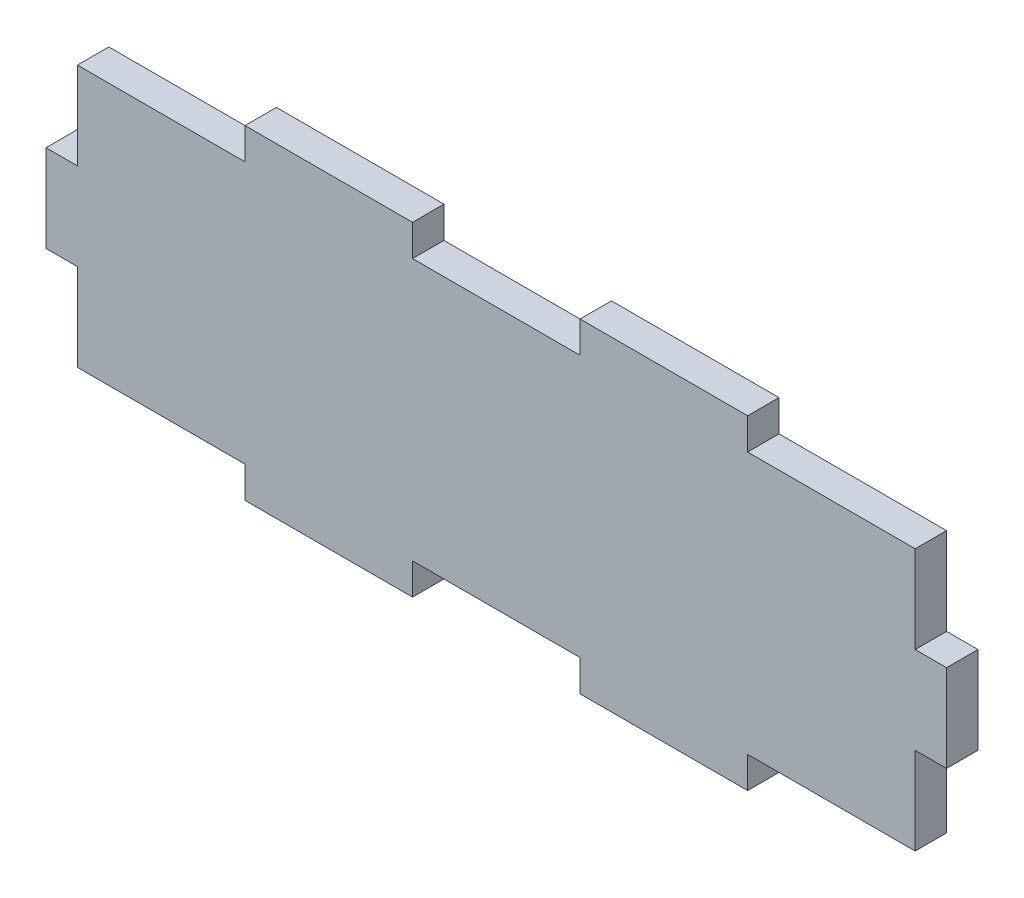
ISO-10303-21;
HEADER;
FILE_DESCRIPTION(('STEP AP214'),'2;1');
FILE_NAME('part.step','',(''),(''),'','','');
FILE_SCHEMA(('AUTOMOTIVE_DESIGN { 1 0 10303 214 1 1 1 1 }'));
ENDSEC;
DATA;
#1=APPLICATION_CONTEXT('core data for automotive mechanical design processes');
#2=APPLICATION_PROTOCOL_DEFINITION('international standard','automotive_design',2000,#1);
#3=PRODUCT_CONTEXT('',#1,'mechanical');
#4=PRODUCT('Part','Part','',(#3));
#5=PRODUCT_RELATED_PRODUCT_CATEGORY('part','',(#4));
#6=PRODUCT_DEFINITION_FORMATION('','',#4);
#7=PRODUCT_DEFINITION_CONTEXT('part definition',#1,'design');
#8=PRODUCT_DEFINITION('design','',#6,#7);
#9=PRODUCT_DEFINITION_SHAPE('','',#8);
#10=(LENGTH_UNIT() NAMED_UNIT(*) SI_UNIT(.MILLI.,.METRE.));
#11=(NAMED_UNIT(*) PLANE_ANGLE_UNIT() SI_UNIT($,.RADIAN.));
#12=(NAMED_UNIT(*) SI_UNIT($,.STERADIAN.) SOLID_ANGLE_UNIT());
#13=UNCERTAINTY_MEASURE_WITH_UNIT(LENGTH_MEASURE(1.E-05),#10,'distance_accuracy_value','');
#14=(GEOMETRIC_REPRESENTATION_CONTEXT(3) GLOBAL_UNCERTAINTY_ASSIGNED_CONTEXT((#13)) GLOBAL_UNIT_ASSIGNED_CONTEXT((#10,
#11,#12)) REPRESENTATION_CONTEXT('',''));
#15=CARTESIAN_POINT('',(0.,0.,0.));
#16=DIRECTION('',(0.,0.,1.));
#17=DIRECTION('',(1.,0.,0.));
#18=AXIS2_PLACEMENT_3D('',#15,#16,#17);
#19=CARTESIAN_POINT('',(0.,0.,3.));
#20=DIRECTION('',(1.,0.,0.));
#21=DIRECTION('',(0.,1.,0.));
#22=AXIS2_PLACEMENT_3D('',#19,#20,#21);
#23=PLANE('',#22);
#24=DIRECTION('',(0.,-1.,0.));
#25=VECTOR('',#24,1.);
#26=CARTESIAN_POINT('',(0.,0.,0.));
#27=LINE('',#26,#25);
#28=CARTESIAN_POINT('',(0.,8.33333333333333,0.));
#29=VERTEX_POINT('',#28);
#30=CARTESIAN_POINT('',(0.,0.,0.));
#31=VERTEX_POINT('',#30);
#32=EDGE_CURVE('E249',#29,#31,#27,.T.);
#33=ORIENTED_EDGE('',*,*,#32,.T.);
#34=DIRECTION('',(0.,0.,-1.));
#35=VECTOR('',#34,1.);
#36=CARTESIAN_POINT('',(0.,0.,3.));
#37=LINE('',#36,#35);
#38=CARTESIAN_POINT('',(0.,0.,3.));
#39=VERTEX_POINT('',#38);
#40=EDGE_CURVE('E11',#39,#31,#37,.T.);
#41=ORIENTED_EDGE('',*,*,#40,.F.);
#42=DIRECTION('',(0.,-1.,0.));
#43=VECTOR('',#42,1.);
#44=CARTESIAN_POINT('',(0.,0.,3.));
#45=LINE('',#44,#43);
#46=CARTESIAN_POINT('',(0.,8.33333333333333,3.));
#47=VERTEX_POINT('',#46);
#48=EDGE_CURVE('E303',#47,#39,#45,.T.);
#49=ORIENTED_EDGE('',*,*,#48,.F.);
#50=DIRECTION('',(0.,0.,-1.));
#51=VECTOR('',#50,1.);
#52=CARTESIAN_POINT('',(0.,8.33333333333333,3.));
#53=LINE('',#52,#51);
#54=EDGE_CURVE('E245',#47,#29,#53,.T.);
#55=ORIENTED_EDGE('',*,*,#54,.T.);
#56=EDGE_LOOP('',(#33,#41,#49,#55));
#57=FACE_BOUND('',#56,.T.);
#58=ADVANCED_FACE('F33',(#57),#23,.F.);
#59=CARTESIAN_POINT('',(0.,0.,3.));
#60=DIRECTION('',(0.,1.,0.));
#61=DIRECTION('',(0.,0.,1.));
#62=AXIS2_PLACEMENT_3D('',#59,#60,#61);
#63=PLANE('',#62);
#64=DIRECTION('',(1.,0.,0.));
#65=VECTOR('',#64,1.);
#66=CARTESIAN_POINT('',(0.,0.,0.));
#67=LINE('',#66,#65);
#68=CARTESIAN_POINT('',(16.,0.,0.));
#69=VERTEX_POINT('',#68);
#70=EDGE_CURVE('E252',#31,#69,#67,.T.);
#71=ORIENTED_EDGE('',*,*,#70,.T.);
#72=DIRECTION('',(0.,0.,-1.));
#73=VECTOR('',#72,1.);
#74=CARTESIAN_POINT('',(16.,0.,3.));
#75=LINE('',#74,#73);
#76=CARTESIAN_POINT('',(16.,0.,3.));
#77=VERTEX_POINT('',#76);
#78=EDGE_CURVE('E41',#77,#69,#75,.T.);
#79=ORIENTED_EDGE('',*,*,#78,.F.);
#80=DIRECTION('',(1.,0.,0.));
#81=VECTOR('',#80,1.);
#82=CARTESIAN_POINT('',(0.,0.,3.));
#83=LINE('',#82,#81);
#84=EDGE_CURVE('E152',#39,#77,#83,.T.);
#85=ORIENTED_EDGE('',*,*,#84,.F.);
#86=ORIENTED_EDGE('',*,*,#40,.T.);
#87=EDGE_LOOP('',(#71,#79,#85,#86));
#88=FACE_BOUND('',#87,.T.);
#89=ADVANCED_FACE('F461',(#88),#63,.F.);
#90=CARTESIAN_POINT('',(16.,0.,3.));
#91=DIRECTION('',(1.,0.,0.));
#92=DIRECTION('',(0.,0.,-1.));
#93=AXIS2_PLACEMENT_3D('',#90,#91,#92);
#94=PLANE('',#93);
#95=DIRECTION('',(0.,-1.,0.));
#96=VECTOR('',#95,1.);
#97=CARTESIAN_POINT('',(16.,0.,0.));
#98=LINE('',#97,#96);
#99=CARTESIAN_POINT('',(16.,-3.,0.));
#100=VERTEX_POINT('',#99);
#101=EDGE_CURVE('E254',#69,#100,#98,.T.);
#102=ORIENTED_EDGE('',*,*,#101,.T.);
#103=DIRECTION('',(0.,0.,-1.));
#104=VECTOR('',#103,1.);
#105=CARTESIAN_POINT('',(16.,-3.,3.));
#106=LINE('',#105,#104);
#107=CARTESIAN_POINT('',(16.,-3.,3.));
#108=VERTEX_POINT('',#107);
#109=EDGE_CURVE('E370',#108,#100,#106,.T.);
#110=ORIENTED_EDGE('',*,*,#109,.F.);
#111=DIRECTION('',(0.,-1.,0.));
#112=VECTOR('',#111,1.);
#113=CARTESIAN_POINT('',(16.,0.,3.));
#114=LINE('',#113,#112);
#115=EDGE_CURVE('E378',#77,#108,#114,.T.);
#116=ORIENTED_EDGE('',*,*,#115,.F.);
#117=ORIENTED_EDGE('',*,*,#78,.T.);
#118=EDGE_LOOP('',(#102,#110,#116,#117));
#119=FACE_BOUND('',#118,.T.);
#120=ADVANCED_FACE('F376',(#119),#94,.F.);
#121=CARTESIAN_POINT('',(16.,-3.,3.));
#122=DIRECTION('',(0.,1.,0.));
#123=DIRECTION('',(0.,0.,1.));
#124=AXIS2_PLACEMENT_3D('',#121,#122,#123);
#125=PLANE('',#124);
#126=DIRECTION('',(1.,0.,0.));
#127=VECTOR('',#126,1.);
#128=CARTESIAN_POINT('',(16.,-3.,0.));
#129=LINE('',#128,#127);
#130=CARTESIAN_POINT('',(32.,-3.,0.));
#131=VERTEX_POINT('',#130);
#132=EDGE_CURVE('E256',#100,#131,#129,.T.);
#133=ORIENTED_EDGE('',*,*,#132,.T.);
#134=DIRECTION('',(0.,0.,-1.));
#135=VECTOR('',#134,1.);
#136=CARTESIAN_POINT('',(32.,-3.,3.));
#137=LINE('',#136,#135);
#138=CARTESIAN_POINT('',(32.,-3.,3.));
#139=VERTEX_POINT('',#138);
#140=EDGE_CURVE('E367',#139,#131,#137,.T.);
#141=ORIENTED_EDGE('',*,*,#140,.F.);
#142=DIRECTION('',(1.,0.,0.));
#143=VECTOR('',#142,1.);
#144=CARTESIAN_POINT('',(16.,-3.,3.));
#145=LINE('',#144,#143);
#146=EDGE_CURVE('E396',#108,#139,#145,.T.);
#147=ORIENTED_EDGE('',*,*,#146,.F.);
#148=ORIENTED_EDGE('',*,*,#109,.T.);
#149=EDGE_LOOP('',(#133,#141,#147,#148));
#150=FACE_BOUND('',#149,.T.);
#151=ADVANCED_FACE('F387',(#150),#125,.F.);
#152=CARTESIAN_POINT('',(32.,0.,3.));
#153=DIRECTION('',(-1.,0.,0.));
#154=DIRECTION('',(0.,0.,1.));
#155=AXIS2_PLACEMENT_3D('',#152,#153,#154);
#156=PLANE('',#155);
#157=DIRECTION('',(0.,1.,0.));
#158=VECTOR('',#157,1.);
#159=CARTESIAN_POINT('',(32.,0.,0.));
#160=LINE('',#159,#158);
#161=CARTESIAN_POINT('',(32.,0.,0.));
#162=VERTEX_POINT('',#161);
#163=EDGE_CURVE('E258',#131,#162,#160,.T.);
#164=ORIENTED_EDGE('',*,*,#163,.T.);
#165=DIRECTION('',(0.,0.,-1.));
#166=VECTOR('',#165,1.);
#167=CARTESIAN_POINT('',(32.,0.,3.));
#168=LINE('',#167,#166);
#169=CARTESIAN_POINT('',(32.,0.,3.));
#170=VERTEX_POINT('',#169);
#171=EDGE_CURVE('E364',#170,#162,#168,.T.);
#172=ORIENTED_EDGE('',*,*,#171,.F.);
#173=DIRECTION('',(0.,1.,0.));
#174=VECTOR('',#173,1.);
#175=CARTESIAN_POINT('',(32.,0.,3.));
#176=LINE('',#175,#174);
#177=EDGE_CURVE('E393',#139,#170,#176,.T.);
#178=ORIENTED_EDGE('',*,*,#177,.F.);
#179=ORIENTED_EDGE('',*,*,#140,.T.);
#180=EDGE_LOOP('',(#164,#172,#178,#179));
#181=FACE_BOUND('',#180,.T.);
#182=ADVANCED_FACE('F391',(#181),#156,.F.);
#183=CARTESIAN_POINT('',(32.,0.,3.));
#184=DIRECTION('',(0.,1.,0.));
#185=DIRECTION('',(0.,0.,1.));
#186=AXIS2_PLACEMENT_3D('',#183,#184,#185);
#187=PLANE('',#186);
#188=DIRECTION('',(1.,0.,0.));
#189=VECTOR('',#188,1.);
#190=CARTESIAN_POINT('',(32.,0.,0.));
#191=LINE('',#190,#189);
#192=CARTESIAN_POINT('',(48.,0.,0.));
#193=VERTEX_POINT('',#192);
#194=EDGE_CURVE('E260',#162,#193,#191,.T.);
#195=ORIENTED_EDGE('',*,*,#194,.T.);
#196=DIRECTION('',(0.,0.,-1.));
#197=VECTOR('',#196,1.);
#198=CARTESIAN_POINT('',(48.,0.,3.));
#199=LINE('',#198,#197);
#200=CARTESIAN_POINT('',(48.,0.,3.));
#201=VERTEX_POINT('',#200);
#202=EDGE_CURVE('E361',#201,#193,#199,.T.);
#203=ORIENTED_EDGE('',*,*,#202,.F.);
#204=DIRECTION('',(1.,0.,0.));
#205=VECTOR('',#204,1.);
#206=CARTESIAN_POINT('',(32.,0.,3.));
#207=LINE('',#206,#205);
#208=EDGE_CURVE('E395',#170,#201,#207,.T.);
#209=ORIENTED_EDGE('',*,*,#208,.F.);
#210=ORIENTED_EDGE('',*,*,#171,.T.);
#211=EDGE_LOOP('',(#195,#203,#209,#210));
#212=FACE_BOUND('',#211,.T.);
#213=ADVANCED_FACE('F474',(#212),#187,.F.);
#214=CARTESIAN_POINT('',(48.,0.,3.));
#215=DIRECTION('',(1.,0.,0.));
#216=DIRECTION('',(0.,0.,-1.));
#217=AXIS2_PLACEMENT_3D('',#214,#215,#216);
#218=PLANE('',#217);
#219=DIRECTION('',(0.,-1.,0.));
#220=VECTOR('',#219,1.);
#221=CARTESIAN_POINT('',(48.,0.,0.));
#222=LINE('',#221,#220);
#223=CARTESIAN_POINT('',(48.,-3.,0.));
#224=VERTEX_POINT('',#223);
#225=EDGE_CURVE('E262',#193,#224,#222,.T.);
#226=ORIENTED_EDGE('',*,*,#225,.T.);
#227=DIRECTION('',(0.,0.,-1.));
#228=VECTOR('',#227,1.);
#229=CARTESIAN_POINT('',(48.,-3.,3.));
#230=LINE('',#229,#228);
#231=CARTESIAN_POINT('',(48.,-3.,3.));
#232=VERTEX_POINT('',#231);
#233=EDGE_CURVE('E358',#232,#224,#230,.T.);
#234=ORIENTED_EDGE('',*,*,#233,.F.);
#235=DIRECTION('',(0.,-1.,0.));
#236=VECTOR('',#235,1.);
#237=CARTESIAN_POINT('',(48.,0.,3.));
#238=LINE('',#237,#236);
#239=EDGE_CURVE('E398',#201,#232,#238,.T.);
#240=ORIENTED_EDGE('',*,*,#239,.F.);
#241=ORIENTED_EDGE('',*,*,#202,.T.);
#242=EDGE_LOOP('',(#226,#234,#240,#241));
#243=FACE_BOUND('',#242,.T.);
#244=ADVANCED_FACE('F477',(#243),#218,.F.);
#245=CARTESIAN_POINT('',(48.,-3.,3.));
#246=DIRECTION('',(0.,1.,0.));
#247=DIRECTION('',(0.,0.,1.));
#248=AXIS2_PLACEMENT_3D('',#245,#246,#247);
#249=PLANE('',#248);
#250=DIRECTION('',(1.,0.,0.));
#251=VECTOR('',#250,1.);
#252=CARTESIAN_POINT('',(48.,-3.,0.));
#253=LINE('',#252,#251);
#254=CARTESIAN_POINT('',(64.,-3.,0.));
#255=VERTEX_POINT('',#254);
#256=EDGE_CURVE('E264',#224,#255,#253,.T.);
#257=ORIENTED_EDGE('',*,*,#256,.T.);
#258=DIRECTION('',(0.,0.,-1.));
#259=VECTOR('',#258,1.);
#260=CARTESIAN_POINT('',(64.,-3.,3.));
#261=LINE('',#260,#259);
#262=CARTESIAN_POINT('',(64.,-3.,3.));
#263=VERTEX_POINT('',#262);
#264=EDGE_CURVE('E355',#263,#255,#261,.T.);
#265=ORIENTED_EDGE('',*,*,#264,.F.);
#266=DIRECTION('',(1.,0.,0.));
#267=VECTOR('',#266,1.);
#268=CARTESIAN_POINT('',(48.,-3.,3.));
#269=LINE('',#268,#267);
#270=EDGE_CURVE('E404',#232,#263,#269,.T.);
#271=ORIENTED_EDGE('',*,*,#270,.F.);
#272=ORIENTED_EDGE('',*,*,#233,.T.);
#273=EDGE_LOOP('',(#257,#265,#271,#272));
#274=FACE_BOUND('',#273,.T.);
#275=ADVANCED_FACE('F481',(#274),#249,.F.);
#276=CARTESIAN_POINT('',(64.,0.,3.));
#277=DIRECTION('',(-1.,0.,0.));
#278=DIRECTION('',(0.,0.,1.));
#279=AXIS2_PLACEMENT_3D('',#276,#277,#278);
#280=PLANE('',#279);
#281=DIRECTION('',(0.,1.,0.));
#282=VECTOR('',#281,1.);
#283=CARTESIAN_POINT('',(64.,0.,0.));
#284=LINE('',#283,#282);
#285=CARTESIAN_POINT('',(64.,0.,0.));
#286=VERTEX_POINT('',#285);
#287=EDGE_CURVE('E266',#255,#286,#284,.T.);
#288=ORIENTED_EDGE('',*,*,#287,.T.);
#289=DIRECTION('',(0.,0.,-1.));
#290=VECTOR('',#289,1.);
#291=CARTESIAN_POINT('',(64.,0.,3.));
#292=LINE('',#291,#290);
#293=CARTESIAN_POINT('',(64.,0.,3.));
#294=VERTEX_POINT('',#293);
#295=EDGE_CURVE('E352',#294,#286,#292,.T.);
#296=ORIENTED_EDGE('',*,*,#295,.F.);
#297=DIRECTION('',(0.,1.,0.));
#298=VECTOR('',#297,1.);
#299=CARTESIAN_POINT('',(64.,0.,3.));
#300=LINE('',#299,#298);
#301=EDGE_CURVE('E406',#263,#294,#300,.T.);
#302=ORIENTED_EDGE('',*,*,#301,.F.);
#303=ORIENTED_EDGE('',*,*,#264,.T.);
#304=EDGE_LOOP('',(#288,#296,#302,#303));
#305=FACE_BOUND('',#304,.T.);
#306=ADVANCED_FACE('F485',(#305),#280,.F.);
#307=CARTESIAN_POINT('',(64.,0.,3.));
#308=DIRECTION('',(0.,1.,0.));
#309=DIRECTION('',(0.,0.,1.));
#310=AXIS2_PLACEMENT_3D('',#307,#308,#309);
#311=PLANE('',#310);
#312=DIRECTION('',(1.,0.,0.));
#313=VECTOR('',#312,1.);
#314=CARTESIAN_POINT('',(64.,0.,0.));
#315=LINE('',#314,#313);
#316=CARTESIAN_POINT('',(80.,0.,0.));
#317=VERTEX_POINT('',#316);
#318=EDGE_CURVE('E268',#286,#317,#315,.T.);
#319=ORIENTED_EDGE('',*,*,#318,.T.);
#320=DIRECTION('',(0.,0.,-1.));
#321=VECTOR('',#320,1.);
#322=CARTESIAN_POINT('',(80.,0.,3.));
#323=LINE('',#322,#321);
#324=CARTESIAN_POINT('',(80.,0.,3.));
#325=VERTEX_POINT('',#324);
#326=EDGE_CURVE('E349',#325,#317,#323,.T.);
#327=ORIENTED_EDGE('',*,*,#326,.F.);
#328=DIRECTION('',(1.,0.,0.));
#329=VECTOR('',#328,1.);
#330=CARTESIAN_POINT('',(64.,0.,3.));
#331=LINE('',#330,#329);
#332=EDGE_CURVE('E408',#294,#325,#331,.T.);
#333=ORIENTED_EDGE('',*,*,#332,.F.);
#334=ORIENTED_EDGE('',*,*,#295,.T.);
#335=EDGE_LOOP('',(#319,#327,#333,#334));
#336=FACE_BOUND('',#335,.T.);
#337=ADVANCED_FACE('F489',(#336),#311,.F.);
#338=CARTESIAN_POINT('',(80.,0.,3.));
#339=DIRECTION('',(-1.,0.,0.));
#340=DIRECTION('',(0.,0.,1.));
#341=AXIS2_PLACEMENT_3D('',#338,#339,#340);
#342=PLANE('',#341);
#343=DIRECTION('',(0.,1.,0.));
#344=VECTOR('',#343,1.);
#345=CARTESIAN_POINT('',(80.,0.,0.));
#346=LINE('',#345,#344);
#347=CARTESIAN_POINT('',(80.,8.33333333333333,0.));
#348=VERTEX_POINT('',#347);
#349=EDGE_CURVE('E270',#317,#348,#346,.T.);
#350=ORIENTED_EDGE('',*,*,#349,.T.);
#351=DIRECTION('',(0.,0.,-1.));
#352=VECTOR('',#351,1.);
#353=CARTESIAN_POINT('',(80.,8.33333333333333,3.));
#354=LINE('',#353,#352);
#355=CARTESIAN_POINT('',(80.,8.33333333333333,3.));
#356=VERTEX_POINT('',#355);
#357=EDGE_CURVE('E346',#356,#348,#354,.T.);
#358=ORIENTED_EDGE('',*,*,#357,.F.);
#359=DIRECTION('',(0.,1.,0.));
#360=VECTOR('',#359,1.);
#361=CARTESIAN_POINT('',(80.,0.,3.));
#362=LINE('',#361,#360);
#363=EDGE_CURVE('E410',#325,#356,#362,.T.);
#364=ORIENTED_EDGE('',*,*,#363,.F.);
#365=ORIENTED_EDGE('',*,*,#326,.T.);
#366=EDGE_LOOP('',(#350,#358,#364,#365));
#367=FACE_BOUND('',#366,.T.);
#368=ADVANCED_FACE('F493',(#367),#342,.F.);
#369=CARTESIAN_POINT('',(80.,8.33333333333333,3.));
#370=DIRECTION('',(0.,1.,0.));
#371=DIRECTION('',(0.,0.,1.));
#372=AXIS2_PLACEMENT_3D('',#369,#370,#371);
#373=PLANE('',#372);
#374=DIRECTION('',(1.,0.,0.));
#375=VECTOR('',#374,1.);
#376=CARTESIAN_POINT('',(80.,8.33333333333333,0.));
#377=LINE('',#376,#375);
#378=CARTESIAN_POINT('',(83.,8.33333333333333,0.));
#379=VERTEX_POINT('',#378);
#380=EDGE_CURVE('E272',#348,#379,#377,.T.);
#381=ORIENTED_EDGE('',*,*,#380,.T.);
#382=DIRECTION('',(0.,0.,-1.));
#383=VECTOR('',#382,1.);
#384=CARTESIAN_POINT('',(83.,8.33333333333333,3.));
#385=LINE('',#384,#383);
#386=CARTESIAN_POINT('',(83.,8.33333333333333,3.));
#387=VERTEX_POINT('',#386);
#388=EDGE_CURVE('E343',#387,#379,#385,.T.);
#389=ORIENTED_EDGE('',*,*,#388,.F.);
#390=DIRECTION('',(1.,0.,0.));
#391=VECTOR('',#390,1.);
#392=CARTESIAN_POINT('',(80.,8.33333333333333,3.));
#393=LINE('',#392,#391);
#394=EDGE_CURVE('E412',#356,#387,#393,.T.);
#395=ORIENTED_EDGE('',*,*,#394,.F.);
#396=ORIENTED_EDGE('',*,*,#357,.T.);
#397=EDGE_LOOP('',(#381,#389,#395,#396));
#398=FACE_BOUND('',#397,.T.);
#399=ADVANCED_FACE('F497',(#398),#373,.F.);
#400=CARTESIAN_POINT('',(83.,16.6666666666667,3.));
#401=DIRECTION('',(-1.,0.,0.));
#402=DIRECTION('',(0.,0.,1.));
#403=AXIS2_PLACEMENT_3D('',#400,#401,#402);
#404=PLANE('',#403);
#405=DIRECTION('',(0.,1.,0.));
#406=VECTOR('',#405,1.);
#407=CARTESIAN_POINT('',(83.,16.6666666666667,0.));
#408=LINE('',#407,#406);
#409=CARTESIAN_POINT('',(83.,16.6666666666667,0.));
#410=VERTEX_POINT('',#409);
#411=EDGE_CURVE('E274',#379,#410,#408,.T.);
#412=ORIENTED_EDGE('',*,*,#411,.T.);
#413=DIRECTION('',(0.,0.,-1.));
#414=VECTOR('',#413,1.);
#415=CARTESIAN_POINT('',(83.,16.6666666666667,3.));
#416=LINE('',#415,#414);
#417=CARTESIAN_POINT('',(83.,16.6666666666667,3.));
#418=VERTEX_POINT('',#417);
#419=EDGE_CURVE('E340',#418,#410,#416,.T.);
#420=ORIENTED_EDGE('',*,*,#419,.F.);
#421=DIRECTION('',(0.,1.,0.));
#422=VECTOR('',#421,1.);
#423=CARTESIAN_POINT('',(83.,16.6666666666667,3.));
#424=LINE('',#423,#422);
#425=EDGE_CURVE('E414',#387,#418,#424,.T.);
#426=ORIENTED_EDGE('',*,*,#425,.F.);
#427=ORIENTED_EDGE('',*,*,#388,.T.);
#428=EDGE_LOOP('',(#412,#420,#426,#427));
#429=FACE_BOUND('',#428,.T.);
#430=ADVANCED_FACE('F501',(#429),#404,.F.);
#431=CARTESIAN_POINT('',(80.,16.6666666666667,3.));
#432=DIRECTION('',(0.,-1.,0.));
#433=DIRECTION('',(0.,0.,-1.));
#434=AXIS2_PLACEMENT_3D('',#431,#432,#433);
#435=PLANE('',#434);
#436=DIRECTION('',(-1.,0.,0.));
#437=VECTOR('',#436,1.);
#438=CARTESIAN_POINT('',(80.,16.6666666666667,0.));
#439=LINE('',#438,#437);
#440=CARTESIAN_POINT('',(80.,16.6666666666667,0.));
#441=VERTEX_POINT('',#440);
#442=EDGE_CURVE('E276',#410,#441,#439,.T.);
#443=ORIENTED_EDGE('',*,*,#442,.T.);
#444=DIRECTION('',(0.,0.,-1.));
#445=VECTOR('',#444,1.);
#446=CARTESIAN_POINT('',(80.,16.6666666666667,3.));
#447=LINE('',#446,#445);
#448=CARTESIAN_POINT('',(80.,16.6666666666667,3.));
#449=VERTEX_POINT('',#448);
#450=EDGE_CURVE('E337',#449,#441,#447,.T.);
#451=ORIENTED_EDGE('',*,*,#450,.F.);
#452=DIRECTION('',(-1.,0.,0.));
#453=VECTOR('',#452,1.);
#454=CARTESIAN_POINT('',(80.,16.6666666666667,3.));
#455=LINE('',#454,#453);
#456=EDGE_CURVE('E416',#418,#449,#455,.T.);
#457=ORIENTED_EDGE('',*,*,#456,.F.);
#458=ORIENTED_EDGE('',*,*,#419,.T.);
#459=EDGE_LOOP('',(#443,#451,#457,#458));
#460=FACE_BOUND('',#459,.T.);
#461=ADVANCED_FACE('F505',(#460),#435,.F.);
#462=CARTESIAN_POINT('',(80.,16.6666666666667,3.));
#463=DIRECTION('',(-1.,0.,0.));
#464=DIRECTION('',(0.,0.,1.));
#465=AXIS2_PLACEMENT_3D('',#462,#463,#464);
#466=PLANE('',#465);
#467=DIRECTION('',(0.,1.,0.));
#468=VECTOR('',#467,1.);
#469=CARTESIAN_POINT('',(80.,16.6666666666667,0.));
#470=LINE('',#469,#468);
#471=CARTESIAN_POINT('',(80.,25.,0.));
#472=VERTEX_POINT('',#471);
#473=EDGE_CURVE('E278',#441,#472,#470,.T.);
#474=ORIENTED_EDGE('',*,*,#473,.T.);
#475=DIRECTION('',(0.,0.,-1.));
#476=VECTOR('',#475,1.);
#477=CARTESIAN_POINT('',(80.,25.,3.));
#478=LINE('',#477,#476);
#479=CARTESIAN_POINT('',(80.,25.,3.));
#480=VERTEX_POINT('',#479);
#481=EDGE_CURVE('E334',#480,#472,#478,.T.);
#482=ORIENTED_EDGE('',*,*,#481,.F.);
#483=DIRECTION('',(0.,1.,0.));
#484=VECTOR('',#483,1.);
#485=CARTESIAN_POINT('',(80.,16.6666666666667,3.));
#486=LINE('',#485,#484);
#487=EDGE_CURVE('E418',#449,#480,#486,.T.);
#488=ORIENTED_EDGE('',*,*,#487,.F.);
#489=ORIENTED_EDGE('',*,*,#450,.T.);
#490=EDGE_LOOP('',(#474,#482,#488,#489));
#491=FACE_BOUND('',#490,.T.);
#492=ADVANCED_FACE('F509',(#491),#466,.F.);
#493=CARTESIAN_POINT('',(64.,25.,3.));
#494=DIRECTION('',(0.,-1.,0.));
#495=DIRECTION('',(0.,0.,-1.));
#496=AXIS2_PLACEMENT_3D('',#493,#494,#495);
#497=PLANE('',#496);
#498=DIRECTION('',(-1.,0.,0.));
#499=VECTOR('',#498,1.);
#500=CARTESIAN_POINT('',(64.,25.,0.));
#501=LINE('',#500,#499);
#502=CARTESIAN_POINT('',(64.,25.,0.));
#503=VERTEX_POINT('',#502);
#504=EDGE_CURVE('E280',#472,#503,#501,.T.);
#505=ORIENTED_EDGE('',*,*,#504,.T.);
#506=DIRECTION('',(0.,0.,-1.));
#507=VECTOR('',#506,1.);
#508=CARTESIAN_POINT('',(64.,25.,3.));
#509=LINE('',#508,#507);
#510=CARTESIAN_POINT('',(64.,25.,3.));
#511=VERTEX_POINT('',#510);
#512=EDGE_CURVE('E331',#511,#503,#509,.T.);
#513=ORIENTED_EDGE('',*,*,#512,.F.);
#514=DIRECTION('',(-1.,0.,0.));
#515=VECTOR('',#514,1.);
#516=CARTESIAN_POINT('',(64.,25.,3.));
#517=LINE('',#516,#515);
#518=EDGE_CURVE('E420',#480,#511,#517,.T.);
#519=ORIENTED_EDGE('',*,*,#518,.F.);
#520=ORIENTED_EDGE('',*,*,#481,.T.);
#521=EDGE_LOOP('',(#505,#513,#519,#520));
#522=FACE_BOUND('',#521,.T.);
#523=ADVANCED_FACE('F513',(#522),#497,.F.);
#524=CARTESIAN_POINT('',(64.,25.,3.));
#525=DIRECTION('',(-1.,0.,0.));
#526=DIRECTION('',(0.,0.,1.));
#527=AXIS2_PLACEMENT_3D('',#524,#525,#526);
#528=PLANE('',#527);
#529=DIRECTION('',(0.,1.,0.));
#530=VECTOR('',#529,1.);
#531=CARTESIAN_POINT('',(64.,25.,0.));
#532=LINE('',#531,#530);
#533=CARTESIAN_POINT('',(64.,28.,0.));
#534=VERTEX_POINT('',#533);
#535=EDGE_CURVE('E282',#503,#534,#532,.T.);
#536=ORIENTED_EDGE('',*,*,#535,.T.);
#537=DIRECTION('',(0.,0.,-1.));
#538=VECTOR('',#537,1.);
#539=CARTESIAN_POINT('',(64.,28.,3.));
#540=LINE('',#539,#538);
#541=CARTESIAN_POINT('',(64.,28.,3.));
#542=VERTEX_POINT('',#541);
#543=EDGE_CURVE('E328',#542,#534,#540,.T.);
#544=ORIENTED_EDGE('',*,*,#543,.F.);
#545=DIRECTION('',(0.,1.,0.));
#546=VECTOR('',#545,1.);
#547=CARTESIAN_POINT('',(64.,25.,3.));
#548=LINE('',#547,#546);
#549=EDGE_CURVE('E422',#511,#542,#548,.T.);
#550=ORIENTED_EDGE('',*,*,#549,.F.);
#551=ORIENTED_EDGE('',*,*,#512,.T.);
#552=EDGE_LOOP('',(#536,#544,#550,#551));
#553=FACE_BOUND('',#552,.T.);
#554=ADVANCED_FACE('F517',(#553),#528,.F.);
#555=CARTESIAN_POINT('',(48.,28.,3.));
#556=DIRECTION('',(0.,-1.,0.));
#557=DIRECTION('',(0.,0.,-1.));
#558=AXIS2_PLACEMENT_3D('',#555,#556,#557);
#559=PLANE('',#558);
#560=DIRECTION('',(-1.,0.,0.));
#561=VECTOR('',#560,1.);
#562=CARTESIAN_POINT('',(48.,28.,0.));
#563=LINE('',#562,#561);
#564=CARTESIAN_POINT('',(48.,28.,0.));
#565=VERTEX_POINT('',#564);
#566=EDGE_CURVE('E284',#534,#565,#563,.T.);
#567=ORIENTED_EDGE('',*,*,#566,.T.);
#568=DIRECTION('',(0.,0.,-1.));
#569=VECTOR('',#568,1.);
#570=CARTESIAN_POINT('',(48.,28.,3.));
#571=LINE('',#570,#569);
#572=CARTESIAN_POINT('',(48.,28.,3.));
#573=VERTEX_POINT('',#572);
#574=EDGE_CURVE('E325',#573,#565,#571,.T.);
#575=ORIENTED_EDGE('',*,*,#574,.F.);
#576=DIRECTION('',(-1.,0.,0.));
#577=VECTOR('',#576,1.);
#578=CARTESIAN_POINT('',(48.,28.,3.));
#579=LINE('',#578,#577);
#580=EDGE_CURVE('E424',#542,#573,#579,.T.);
#581=ORIENTED_EDGE('',*,*,#580,.F.);
#582=ORIENTED_EDGE('',*,*,#543,.T.);
#583=EDGE_LOOP('',(#567,#575,#581,#582));
#584=FACE_BOUND('',#583,.T.);
#585=ADVANCED_FACE('F521',(#584),#559,.F.);
#586=CARTESIAN_POINT('',(48.,25.,3.));
#587=DIRECTION('',(1.,0.,0.));
#588=DIRECTION('',(0.,0.,-1.));
#589=AXIS2_PLACEMENT_3D('',#586,#587,#588);
#590=PLANE('',#589);
#591=DIRECTION('',(0.,-1.,0.));
#592=VECTOR('',#591,1.);
#593=CARTESIAN_POINT('',(48.,25.,0.));
#594=LINE('',#593,#592);
#595=CARTESIAN_POINT('',(48.,25.,0.));
#596=VERTEX_POINT('',#595);
#597=EDGE_CURVE('E286',#565,#596,#594,.T.);
#598=ORIENTED_EDGE('',*,*,#597,.T.);
#599=DIRECTION('',(0.,0.,-1.));
#600=VECTOR('',#599,1.);
#601=CARTESIAN_POINT('',(48.,25.,3.));
#602=LINE('',#601,#600);
#603=CARTESIAN_POINT('',(48.,25.,3.));
#604=VERTEX_POINT('',#603);
#605=EDGE_CURVE('E322',#604,#596,#602,.T.);
#606=ORIENTED_EDGE('',*,*,#605,.F.);
#607=DIRECTION('',(0.,-1.,0.));
#608=VECTOR('',#607,1.);
#609=CARTESIAN_POINT('',(48.,25.,3.));
#610=LINE('',#609,#608);
#611=EDGE_CURVE('E426',#573,#604,#610,.T.);
#612=ORIENTED_EDGE('',*,*,#611,.F.);
#613=ORIENTED_EDGE('',*,*,#574,.T.);
#614=EDGE_LOOP('',(#598,#606,#612,#613));
#615=FACE_BOUND('',#614,.T.);
#616=ADVANCED_FACE('F525',(#615),#590,.F.);
#617=CARTESIAN_POINT('',(32.,25.,3.));
#618=DIRECTION('',(0.,-1.,0.));
#619=DIRECTION('',(0.,0.,-1.));
#620=AXIS2_PLACEMENT_3D('',#617,#618,#619);
#621=PLANE('',#620);
#622=DIRECTION('',(-1.,0.,0.));
#623=VECTOR('',#622,1.);
#624=CARTESIAN_POINT('',(32.,25.,0.));
#625=LINE('',#624,#623);
#626=CARTESIAN_POINT('',(32.,25.,0.));
#627=VERTEX_POINT('',#626);
#628=EDGE_CURVE('E288',#596,#627,#625,.T.);
#629=ORIENTED_EDGE('',*,*,#628,.T.);
#630=DIRECTION('',(0.,0.,-1.));
#631=VECTOR('',#630,1.);
#632=CARTESIAN_POINT('',(32.,25.,3.));
#633=LINE('',#632,#631);
#634=CARTESIAN_POINT('',(32.,25.,3.));
#635=VERTEX_POINT('',#634);
#636=EDGE_CURVE('E319',#635,#627,#633,.T.);
#637=ORIENTED_EDGE('',*,*,#636,.F.);
#638=DIRECTION('',(-1.,0.,0.));
#639=VECTOR('',#638,1.);
#640=CARTESIAN_POINT('',(32.,25.,3.));
#641=LINE('',#640,#639);
#642=EDGE_CURVE('E428',#604,#635,#641,.T.);
#643=ORIENTED_EDGE('',*,*,#642,.F.);
#644=ORIENTED_EDGE('',*,*,#605,.T.);
#645=EDGE_LOOP('',(#629,#637,#643,#644));
#646=FACE_BOUND('',#645,.T.);
#647=ADVANCED_FACE('F529',(#646),#621,.F.);
#648=CARTESIAN_POINT('',(32.,25.,3.));
#649=DIRECTION('',(-1.,0.,0.));
#650=DIRECTION('',(0.,0.,1.));
#651=AXIS2_PLACEMENT_3D('',#648,#649,#650);
#652=PLANE('',#651);
#653=DIRECTION('',(0.,1.,0.));
#654=VECTOR('',#653,1.);
#655=CARTESIAN_POINT('',(32.,25.,0.));
#656=LINE('',#655,#654);
#657=CARTESIAN_POINT('',(32.,28.,0.));
#658=VERTEX_POINT('',#657);
#659=EDGE_CURVE('E290',#627,#658,#656,.T.);
#660=ORIENTED_EDGE('',*,*,#659,.T.);
#661=DIRECTION('',(0.,0.,-1.));
#662=VECTOR('',#661,1.);
#663=CARTESIAN_POINT('',(32.,28.,3.));
#664=LINE('',#663,#662);
#665=CARTESIAN_POINT('',(32.,28.,3.));
#666=VERTEX_POINT('',#665);
#667=EDGE_CURVE('E316',#666,#658,#664,.T.);
#668=ORIENTED_EDGE('',*,*,#667,.F.);
#669=DIRECTION('',(0.,1.,0.));
#670=VECTOR('',#669,1.);
#671=CARTESIAN_POINT('',(32.,25.,3.));
#672=LINE('',#671,#670);
#673=EDGE_CURVE('E430',#635,#666,#672,.T.);
#674=ORIENTED_EDGE('',*,*,#673,.F.);
#675=ORIENTED_EDGE('',*,*,#636,.T.);
#676=EDGE_LOOP('',(#660,#668,#674,#675));
#677=FACE_BOUND('',#676,.T.);
#678=ADVANCED_FACE('F533',(#677),#652,.F.);
#679=CARTESIAN_POINT('',(16.,28.,3.));
#680=DIRECTION('',(0.,-1.,0.));
#681=DIRECTION('',(0.,0.,-1.));
#682=AXIS2_PLACEMENT_3D('',#679,#680,#681);
#683=PLANE('',#682);
#684=DIRECTION('',(-1.,0.,0.));
#685=VECTOR('',#684,1.);
#686=CARTESIAN_POINT('',(16.,28.,0.));
#687=LINE('',#686,#685);
#688=CARTESIAN_POINT('',(16.,28.,0.));
#689=VERTEX_POINT('',#688);
#690=EDGE_CURVE('E292',#658,#689,#687,.T.);
#691=ORIENTED_EDGE('',*,*,#690,.T.);
#692=DIRECTION('',(0.,0.,-1.));
#693=VECTOR('',#692,1.);
#694=CARTESIAN_POINT('',(16.,28.,3.));
#695=LINE('',#694,#693);
#696=CARTESIAN_POINT('',(16.,28.,3.));
#697=VERTEX_POINT('',#696);
#698=EDGE_CURVE('E313',#697,#689,#695,.T.);
#699=ORIENTED_EDGE('',*,*,#698,.F.);
#700=DIRECTION('',(-1.,0.,0.));
#701=VECTOR('',#700,1.);
#702=CARTESIAN_POINT('',(16.,28.,3.));
#703=LINE('',#702,#701);
#704=EDGE_CURVE('E432',#666,#697,#703,.T.);
#705=ORIENTED_EDGE('',*,*,#704,.F.);
#706=ORIENTED_EDGE('',*,*,#667,.T.);
#707=EDGE_LOOP('',(#691,#699,#705,#706));
#708=FACE_BOUND('',#707,.T.);
#709=ADVANCED_FACE('F537',(#708),#683,.F.);
#710=CARTESIAN_POINT('',(16.,25.,3.));
#711=DIRECTION('',(1.,0.,0.));
#712=DIRECTION('',(0.,0.,-1.));
#713=AXIS2_PLACEMENT_3D('',#710,#711,#712);
#714=PLANE('',#713);
#715=DIRECTION('',(0.,-1.,0.));
#716=VECTOR('',#715,1.);
#717=CARTESIAN_POINT('',(16.,25.,0.));
#718=LINE('',#717,#716);
#719=CARTESIAN_POINT('',(16.,25.,0.));
#720=VERTEX_POINT('',#719);
#721=EDGE_CURVE('E294',#689,#720,#718,.T.);
#722=ORIENTED_EDGE('',*,*,#721,.T.);
#723=DIRECTION('',(0.,0.,-1.));
#724=VECTOR('',#723,1.);
#725=CARTESIAN_POINT('',(16.,25.,3.));
#726=LINE('',#725,#724);
#727=CARTESIAN_POINT('',(16.,25.,3.));
#728=VERTEX_POINT('',#727);
#729=EDGE_CURVE('E310',#728,#720,#726,.T.);
#730=ORIENTED_EDGE('',*,*,#729,.F.);
#731=DIRECTION('',(0.,-1.,0.));
#732=VECTOR('',#731,1.);
#733=CARTESIAN_POINT('',(16.,25.,3.));
#734=LINE('',#733,#732);
#735=EDGE_CURVE('E434',#697,#728,#734,.T.);
#736=ORIENTED_EDGE('',*,*,#735,.F.);
#737=ORIENTED_EDGE('',*,*,#698,.T.);
#738=EDGE_LOOP('',(#722,#730,#736,#737));
#739=FACE_BOUND('',#738,.T.);
#740=ADVANCED_FACE('F541',(#739),#714,.F.);
#741=CARTESIAN_POINT('',(0.,25.,3.));
#742=DIRECTION('',(0.,-1.,0.));
#743=DIRECTION('',(0.,0.,-1.));
#744=AXIS2_PLACEMENT_3D('',#741,#742,#743);
#745=PLANE('',#744);
#746=DIRECTION('',(-1.,0.,0.));
#747=VECTOR('',#746,1.);
#748=CARTESIAN_POINT('',(0.,25.,0.));
#749=LINE('',#748,#747);
#750=CARTESIAN_POINT('',(0.,25.,0.));
#751=VERTEX_POINT('',#750);
#752=EDGE_CURVE('E296',#720,#751,#749,.T.);
#753=ORIENTED_EDGE('',*,*,#752,.T.);
#754=DIRECTION('',(0.,0.,-1.));
#755=VECTOR('',#754,1.);
#756=CARTESIAN_POINT('',(0.,25.,3.));
#757=LINE('',#756,#755);
#758=CARTESIAN_POINT('',(0.,25.,3.));
#759=VERTEX_POINT('',#758);
#760=EDGE_CURVE('E307',#759,#751,#757,.T.);
#761=ORIENTED_EDGE('',*,*,#760,.F.);
#762=DIRECTION('',(-1.,0.,0.));
#763=VECTOR('',#762,1.);
#764=CARTESIAN_POINT('',(0.,25.,3.));
#765=LINE('',#764,#763);
#766=EDGE_CURVE('E436',#728,#759,#765,.T.);
#767=ORIENTED_EDGE('',*,*,#766,.F.);
#768=ORIENTED_EDGE('',*,*,#729,.T.);
#769=EDGE_LOOP('',(#753,#761,#767,#768));
#770=FACE_BOUND('',#769,.T.);
#771=ADVANCED_FACE('F442',(#770),#745,.F.);
#772=CARTESIAN_POINT('',(0.,16.6666666666667,3.));
#773=DIRECTION('',(1.,0.,0.));
#774=DIRECTION('',(0.,1.,0.));
#775=AXIS2_PLACEMENT_3D('',#772,#773,#774);
#776=PLANE('',#775);
#777=DIRECTION('',(0.,-1.,0.));
#778=VECTOR('',#777,1.);
#779=CARTESIAN_POINT('',(0.,16.6666666666667,0.));
#780=LINE('',#779,#778);
#781=CARTESIAN_POINT('',(0.,16.6666666666667,0.));
#782=VERTEX_POINT('',#781);
#783=EDGE_CURVE('E298',#751,#782,#780,.T.);
#784=ORIENTED_EDGE('',*,*,#783,.T.);
#785=DIRECTION('',(0.,0.,-1.));
#786=VECTOR('',#785,1.);
#787=CARTESIAN_POINT('',(0.,16.6666666666667,3.));
#788=LINE('',#787,#786);
#789=CARTESIAN_POINT('',(0.,16.6666666666667,3.));
#790=VERTEX_POINT('',#789);
#791=EDGE_CURVE('E240',#790,#782,#788,.T.);
#792=ORIENTED_EDGE('',*,*,#791,.F.);
#793=DIRECTION('',(0.,-1.,0.));
#794=VECTOR('',#793,1.);
#795=CARTESIAN_POINT('',(0.,16.6666666666667,3.));
#796=LINE('',#795,#794);
#797=EDGE_CURVE('E231',#759,#790,#796,.T.);
#798=ORIENTED_EDGE('',*,*,#797,.F.);
#799=ORIENTED_EDGE('',*,*,#760,.T.);
#800=EDGE_LOOP('',(#784,#792,#798,#799));
#801=FACE_BOUND('',#800,.T.);
#802=ADVANCED_FACE('F446',(#801),#776,.F.);
#803=CARTESIAN_POINT('',(0.,16.6666666666667,3.));
#804=DIRECTION('',(0.,-1.,0.));
#805=DIRECTION('',(0.,0.,-1.));
#806=AXIS2_PLACEMENT_3D('',#803,#804,#805);
#807=PLANE('',#806);
#808=DIRECTION('',(-1.,0.,0.));
#809=VECTOR('',#808,1.);
#810=CARTESIAN_POINT('',(0.,16.6666666666667,0.));
#811=LINE('',#810,#809);
#812=CARTESIAN_POINT('',(-3.,16.6666666666667,0.));
#813=VERTEX_POINT('',#812);
#814=EDGE_CURVE('E239',#782,#813,#811,.T.);
#815=ORIENTED_EDGE('',*,*,#814,.T.);
#816=DIRECTION('',(0.,0.,-1.));
#817=VECTOR('',#816,1.);
#818=CARTESIAN_POINT('',(-3.,16.6666666666667,3.));
#819=LINE('',#818,#817);
#820=CARTESIAN_POINT('',(-3.,16.6666666666667,3.));
#821=VERTEX_POINT('',#820);
#822=EDGE_CURVE('E236',#821,#813,#819,.T.);
#823=ORIENTED_EDGE('',*,*,#822,.F.);
#824=DIRECTION('',(-1.,0.,0.));
#825=VECTOR('',#824,1.);
#826=CARTESIAN_POINT('',(0.,16.6666666666667,3.));
#827=LINE('',#826,#825);
#828=EDGE_CURVE('E225',#790,#821,#827,.T.);
#829=ORIENTED_EDGE('',*,*,#828,.F.);
#830=ORIENTED_EDGE('',*,*,#791,.T.);
#831=EDGE_LOOP('',(#815,#823,#829,#830));
#832=FACE_BOUND('',#831,.T.);
#833=ADVANCED_FACE('F237',(#832),#807,.F.);
#834=CARTESIAN_POINT('',(-3.,16.6666666666667,3.));
#835=DIRECTION('',(1.,0.,0.));
#836=DIRECTION('',(0.,1.,0.));
#837=AXIS2_PLACEMENT_3D('',#834,#835,#836);
#838=PLANE('',#837);
#839=DIRECTION('',(0.,-1.,0.));
#840=VECTOR('',#839,1.);
#841=CARTESIAN_POINT('',(-3.,16.6666666666667,0.));
#842=LINE('',#841,#840);
#843=CARTESIAN_POINT('',(-3.,8.33333333333333,0.));
#844=VERTEX_POINT('',#843);
#845=EDGE_CURVE('E138',#813,#844,#842,.T.);
#846=ORIENTED_EDGE('',*,*,#845,.T.);
#847=DIRECTION('',(0.,0.,-1.));
#848=VECTOR('',#847,1.);
#849=CARTESIAN_POINT('',(-3.,8.33333333333333,3.));
#850=LINE('',#849,#848);
#851=CARTESIAN_POINT('',(-3.,8.33333333333333,3.));
#852=VERTEX_POINT('',#851);
#853=EDGE_CURVE('E241',#852,#844,#850,.T.);
#854=ORIENTED_EDGE('',*,*,#853,.F.);
#855=DIRECTION('',(0.,-1.,0.));
#856=VECTOR('',#855,1.);
#857=CARTESIAN_POINT('',(-3.,16.6666666666667,3.));
#858=LINE('',#857,#856);
#859=EDGE_CURVE('E229',#821,#852,#858,.T.);
#860=ORIENTED_EDGE('',*,*,#859,.F.);
#861=ORIENTED_EDGE('',*,*,#822,.T.);
#862=EDGE_LOOP('',(#846,#854,#860,#861));
#863=FACE_BOUND('',#862,.T.);
#864=ADVANCED_FACE('F243',(#863),#838,.F.);
#865=CARTESIAN_POINT('',(0.,8.33333333333333,3.));
#866=DIRECTION('',(0.,1.,0.));
#867=DIRECTION('',(0.,0.,1.));
#868=AXIS2_PLACEMENT_3D('',#865,#866,#867);
#869=PLANE('',#868);
#870=DIRECTION('',(1.,0.,0.));
#871=VECTOR('',#870,1.);
#872=CARTESIAN_POINT('',(0.,8.33333333333333,0.));
#873=LINE('',#872,#871);
#874=EDGE_CURVE('E144',#844,#29,#873,.T.);
#875=ORIENTED_EDGE('',*,*,#874,.T.);
#876=ORIENTED_EDGE('',*,*,#54,.F.);
#877=DIRECTION('',(1.,0.,0.));
#878=VECTOR('',#877,1.);
#879=CARTESIAN_POINT('',(0.,8.33333333333333,3.));
#880=LINE('',#879,#878);
#881=EDGE_CURVE('E49',#852,#47,#880,.T.);
#882=ORIENTED_EDGE('',*,*,#881,.F.);
#883=ORIENTED_EDGE('',*,*,#853,.T.);
#884=EDGE_LOOP('',(#875,#876,#882,#883));
#885=FACE_BOUND('',#884,.T.);
#886=ADVANCED_FACE('F450',(#885),#869,.F.);
#887=CARTESIAN_POINT('',(0.,0.,3.));
#888=DIRECTION('',(0.,0.,1.));
#889=DIRECTION('',(1.,0.,0.));
#890=AXIS2_PLACEMENT_3D('',#887,#888,#889);
#891=PLANE('',#890);
#892=ORIENTED_EDGE('',*,*,#48,.T.);
#893=ORIENTED_EDGE('',*,*,#84,.T.);
#894=ORIENTED_EDGE('',*,*,#115,.T.);
#895=ORIENTED_EDGE('',*,*,#146,.T.);
#896=ORIENTED_EDGE('',*,*,#177,.T.);
#897=ORIENTED_EDGE('',*,*,#208,.T.);
#898=ORIENTED_EDGE('',*,*,#239,.T.);
#899=ORIENTED_EDGE('',*,*,#270,.T.);
#900=ORIENTED_EDGE('',*,*,#301,.T.);
#901=ORIENTED_EDGE('',*,*,#332,.T.);
#902=ORIENTED_EDGE('',*,*,#363,.T.);
#903=ORIENTED_EDGE('',*,*,#394,.T.);
#904=ORIENTED_EDGE('',*,*,#425,.T.);
#905=ORIENTED_EDGE('',*,*,#456,.T.);
#906=ORIENTED_EDGE('',*,*,#487,.T.);
#907=ORIENTED_EDGE('',*,*,#518,.T.);
#908=ORIENTED_EDGE('',*,*,#549,.T.);
#909=ORIENTED_EDGE('',*,*,#580,.T.);
#910=ORIENTED_EDGE('',*,*,#611,.T.);
#911=ORIENTED_EDGE('',*,*,#642,.T.);
#912=ORIENTED_EDGE('',*,*,#673,.T.);
#913=ORIENTED_EDGE('',*,*,#704,.T.);
#914=ORIENTED_EDGE('',*,*,#735,.T.);
#915=ORIENTED_EDGE('',*,*,#766,.T.);
#916=ORIENTED_EDGE('',*,*,#797,.T.);
#917=ORIENTED_EDGE('',*,*,#828,.T.);
#918=ORIENTED_EDGE('',*,*,#859,.T.);
#919=ORIENTED_EDGE('',*,*,#881,.T.);
#920=EDGE_LOOP('',(#892,#893,#894,#895,#896,#897,#898,#899,#900,#901,#902,#903,#904,#905,#906,
#907,#908,#909,#910,#911,#912,#913,#914,#915,#916,#917,#918,#919));
#921=FACE_BOUND('',#920,.T.);
#922=ADVANCED_FACE('F227',(#921),#891,.T.);
#923=CARTESIAN_POINT('',(0.,0.,0.));
#924=DIRECTION('',(0.,0.,1.));
#925=DIRECTION('',(1.,0.,0.));
#926=AXIS2_PLACEMENT_3D('',#923,#924,#925);
#927=PLANE('',#926);
#928=ORIENTED_EDGE('',*,*,#32,.F.);
#929=ORIENTED_EDGE('',*,*,#874,.F.);
#930=ORIENTED_EDGE('',*,*,#845,.F.);
#931=ORIENTED_EDGE('',*,*,#814,.F.);
#932=ORIENTED_EDGE('',*,*,#783,.F.);
#933=ORIENTED_EDGE('',*,*,#752,.F.);
#934=ORIENTED_EDGE('',*,*,#721,.F.);
#935=ORIENTED_EDGE('',*,*,#690,.F.);
#936=ORIENTED_EDGE('',*,*,#659,.F.);
#937=ORIENTED_EDGE('',*,*,#628,.F.);
#938=ORIENTED_EDGE('',*,*,#597,.F.);
#939=ORIENTED_EDGE('',*,*,#566,.F.);
#940=ORIENTED_EDGE('',*,*,#535,.F.);
#941=ORIENTED_EDGE('',*,*,#504,.F.);
#942=ORIENTED_EDGE('',*,*,#473,.F.);
#943=ORIENTED_EDGE('',*,*,#442,.F.);
#944=ORIENTED_EDGE('',*,*,#411,.F.);
#945=ORIENTED_EDGE('',*,*,#380,.F.);
#946=ORIENTED_EDGE('',*,*,#349,.F.);
#947=ORIENTED_EDGE('',*,*,#318,.F.);
#948=ORIENTED_EDGE('',*,*,#287,.F.);
#949=ORIENTED_EDGE('',*,*,#256,.F.);
#950=ORIENTED_EDGE('',*,*,#225,.F.);
#951=ORIENTED_EDGE('',*,*,#194,.F.);
#952=ORIENTED_EDGE('',*,*,#163,.F.);
#953=ORIENTED_EDGE('',*,*,#132,.F.);
#954=ORIENTED_EDGE('',*,*,#101,.F.);
#955=ORIENTED_EDGE('',*,*,#70,.F.);
#956=EDGE_LOOP('',(#928,#929,#930,#931,#932,#933,#934,#935,#936,#937,#938,#939,#940,#941,#942,
#943,#944,#945,#946,#947,#948,#949,#950,#951,#952,#953,#954,#955));
#957=FACE_BOUND('',#956,.T.);
#958=ADVANCED_FACE('F382',(#957),#927,.F.);
#959=CLOSED_SHELL('',(#58,#89,#120,#151,#182,#213,#244,#275,#306,#337,#368,#399,#430,#461,#492,
#523,#554,#585,#616,#647,#678,#709,#740,#771,#802,#833,#864,#886,#922,#958));
#960=MANIFOLD_SOLID_BREP('B2',#959);
#961=ADVANCED_BREP_SHAPE_REPRESENTATION('',(#18,#960),#14);
#962=SHAPE_DEFINITION_REPRESENTATION(#9,#961);
ENDSEC;
END-ISO-10303-21;
